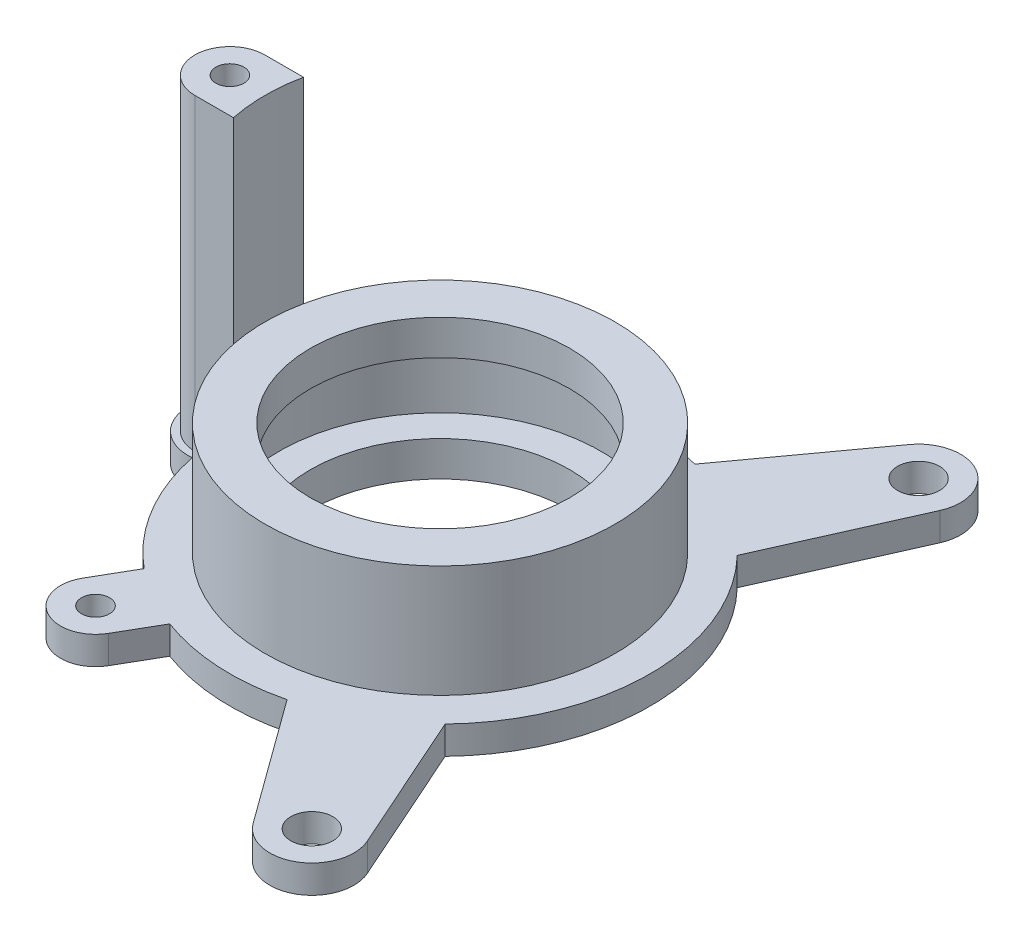
ISO-10303-21;
HEADER;
FILE_DESCRIPTION(('STEP AP214'),'2;1');
FILE_NAME('part.step','',(''),(''),'','','');
FILE_SCHEMA(('AUTOMOTIVE_DESIGN { 1 0 10303 214 1 1 1 1 }'));
ENDSEC;
DATA;
#1=APPLICATION_CONTEXT('core data for automotive mechanical design processes');
#2=APPLICATION_PROTOCOL_DEFINITION('international standard','automotive_design',2000,#1);
#3=PRODUCT_CONTEXT('',#1,'mechanical');
#4=PRODUCT('Part','Part','',(#3));
#5=PRODUCT_RELATED_PRODUCT_CATEGORY('part','',(#4));
#6=PRODUCT_DEFINITION_FORMATION('','',#4);
#7=PRODUCT_DEFINITION_CONTEXT('part definition',#1,'design');
#8=PRODUCT_DEFINITION('design','',#6,#7);
#9=PRODUCT_DEFINITION_SHAPE('','',#8);
#10=(LENGTH_UNIT() NAMED_UNIT(*) SI_UNIT(.MILLI.,.METRE.));
#11=(NAMED_UNIT(*) PLANE_ANGLE_UNIT() SI_UNIT($,.RADIAN.));
#12=(NAMED_UNIT(*) SI_UNIT($,.STERADIAN.) SOLID_ANGLE_UNIT());
#13=UNCERTAINTY_MEASURE_WITH_UNIT(LENGTH_MEASURE(1.E-05),#10,'distance_accuracy_value','');
#14=(GEOMETRIC_REPRESENTATION_CONTEXT(3) GLOBAL_UNCERTAINTY_ASSIGNED_CONTEXT((#13)) GLOBAL_UNIT_ASSIGNED_CONTEXT((#10,
#11,#12)) REPRESENTATION_CONTEXT('',''));
#15=CARTESIAN_POINT('',(0.,0.,0.));
#16=DIRECTION('',(0.,0.,1.));
#17=DIRECTION('',(1.,0.,0.));
#18=AXIS2_PLACEMENT_3D('',#15,#16,#17);
#19=CARTESIAN_POINT('',(0.,0.,0.));
#20=DIRECTION('',(0.,1.,0.));
#21=DIRECTION('',(0.,0.,1.));
#22=AXIS2_PLACEMENT_3D('',#19,#20,#21);
#23=PLANE('',#22);
#24=CARTESIAN_POINT('',(0.,0.,0.));
#25=DIRECTION('',(0.,1.,0.));
#26=DIRECTION('',(0.,0.,1.));
#27=AXIS2_PLACEMENT_3D('',#24,#25,#26);
#28=CIRCLE('',#27,9.25);
#29=CARTESIAN_POINT('',(0.,0.,9.25));
#30=VERTEX_POINT('',#29);
#31=EDGE_CURVE('E284',#30,#30,#28,.T.);
#32=ORIENTED_EDGE('',*,*,#31,.T.);
#33=EDGE_LOOP('',(#32));
#34=FACE_BOUND('',#33,.T.);
#35=CARTESIAN_POINT('',(-15.,0.,0.));
#36=DIRECTION('',(0.,1.,0.));
#37=DIRECTION('',(0.,0.,1.));
#38=AXIS2_PLACEMENT_3D('',#35,#36,#37);
#39=CIRCLE('',#38,1.);
#40=CARTESIAN_POINT('',(-15.,0.,1.));
#41=VERTEX_POINT('',#40);
#42=EDGE_CURVE('E220',#41,#41,#39,.T.);
#43=ORIENTED_EDGE('',*,*,#42,.T.);
#44=EDGE_LOOP('',(#43));
#45=FACE_BOUND('',#44,.T.);
#46=CARTESIAN_POINT('',(-9.00000000000008,0.,15.5884572681198));
#47=DIRECTION('',(0.,1.,0.));
#48=DIRECTION('',(0.,0.,1.));
#49=AXIS2_PLACEMENT_3D('',#46,#47,#48);
#50=CIRCLE('',#49,1.);
#51=CARTESIAN_POINT('',(-9.00000000000008,0.,16.5884572681198));
#52=VERTEX_POINT('',#51);
#53=EDGE_CURVE('E45',#52,#52,#50,.T.);
#54=ORIENTED_EDGE('',*,*,#53,.T.);
#55=EDGE_LOOP('',(#54));
#56=FACE_BOUND('',#55,.T.);
#57=CARTESIAN_POINT('',(12.4999999999999,0.,21.650635094611));
#58=DIRECTION('',(0.,1.,0.));
#59=DIRECTION('',(0.,0.,1.));
#60=AXIS2_PLACEMENT_3D('',#57,#58,#59);
#61=CIRCLE('',#60,1.5);
#62=CARTESIAN_POINT('',(12.4999999999999,0.,23.150635094611));
#63=VERTEX_POINT('',#62);
#64=EDGE_CURVE('E400',#63,#63,#61,.T.);
#65=ORIENTED_EDGE('',*,*,#64,.T.);
#66=EDGE_LOOP('',(#65));
#67=FACE_BOUND('',#66,.T.);
#68=CARTESIAN_POINT('',(12.4999999999999,0.,-21.650635094611));
#69=DIRECTION('',(0.,1.,0.));
#70=DIRECTION('',(0.,0.,1.));
#71=AXIS2_PLACEMENT_3D('',#68,#69,#70);
#72=CIRCLE('',#71,1.5);
#73=CARTESIAN_POINT('',(12.4999999999999,0.,-20.150635094611));
#74=VERTEX_POINT('',#73);
#75=EDGE_CURVE('E388',#74,#74,#72,.F.);
#76=ORIENTED_EDGE('',*,*,#75,.F.);
#77=EDGE_LOOP('',(#76));
#78=FACE_BOUND('',#77,.T.);
#79=CARTESIAN_POINT('',(-15.,0.,0.));
#80=DIRECTION('',(0.,1.,0.));
#81=DIRECTION('',(0.,0.,1.));
#82=AXIS2_PLACEMENT_3D('',#79,#80,#81);
#83=CIRCLE('',#82,3.);
#84=CARTESIAN_POINT('',(-14.7,0.,2.98496231131986));
#85=VERTEX_POINT('',#84);
#86=CARTESIAN_POINT('',(-14.7,0.,-2.98496231131986));
#87=VERTEX_POINT('',#86);
#88=EDGE_CURVE('E368',#85,#87,#83,.F.);
#89=ORIENTED_EDGE('',*,*,#88,.T.);
#90=CARTESIAN_POINT('',(0.,0.,0.));
#91=DIRECTION('',(0.,1.,0.));
#92=DIRECTION('',(0.,0.,1.));
#93=AXIS2_PLACEMENT_3D('',#90,#91,#92);
#94=CIRCLE('',#93,15.);
#95=CARTESIAN_POINT('',(-9.56016323833567,0.,-11.5586884574495));
#96=VERTEX_POINT('',#95);
#97=EDGE_CURVE('E404',#87,#96,#94,.F.);
#98=ORIENTED_EDGE('',*,*,#97,.T.);
#99=DIRECTION('',(-0.500000000000004,0.,-0.866025403784436));
#100=VECTOR('',#99,1.);
#101=CARTESIAN_POINT('',(-2.16506350946109,0.,1.25000000000001));
#102=LINE('',#101,#100);
#103=CARTESIAN_POINT('',(-11.1650635094612,0.,-14.3384572681198));
#104=VERTEX_POINT('',#103);
#105=EDGE_CURVE('E391',#96,#104,#102,.T.);
#106=ORIENTED_EDGE('',*,*,#105,.T.);
#107=CARTESIAN_POINT('',(-9.00000000000008,0.,-15.5884572681198));
#108=DIRECTION('',(0.,1.,0.));
#109=DIRECTION('',(0.,0.,1.));
#110=AXIS2_PLACEMENT_3D('',#107,#108,#109);
#111=CIRCLE('',#110,2.5);
#112=CARTESIAN_POINT('',(-6.83493649053898,0.,-16.8384572681199));
#113=VERTEX_POINT('',#112);
#114=EDGE_CURVE('E380',#104,#113,#111,.F.);
#115=ORIENTED_EDGE('',*,*,#114,.T.);
#116=DIRECTION('',(-0.500000000000004,0.,-0.866025403784436));
#117=VECTOR('',#116,1.);
#118=CARTESIAN_POINT('',(2.16506350946109,0.,-1.25000000000001));
#119=LINE('',#118,#117);
#120=CARTESIAN_POINT('',(-5.23003621941349,0.,-14.0586884574495));
#121=VERTEX_POINT('',#120);
#122=EDGE_CURVE('E374',#121,#113,#119,.T.);
#123=ORIENTED_EDGE('',*,*,#122,.F.);
#124=CARTESIAN_POINT('',(3.63498864822928,0.,-14.5528985953742));
#125=VERTEX_POINT('',#124);
#126=EDGE_CURVE('E595',#121,#125,#94,.F.);
#127=ORIENTED_EDGE('',*,*,#126,.T.);
#128=DIRECTION('',(0.587785252292465,0.,-0.809016994374953));
#129=VECTOR('',#128,1.);
#130=CARTESIAN_POINT('',(-4.54118356261046,0.,-3.29936298571533));
#131=LINE('',#130,#129);
#132=CARTESIAN_POINT('',(10.0729490168751,0.,-23.4139908514884));
#133=VERTEX_POINT('',#132);
#134=EDGE_CURVE('E379',#125,#133,#131,.T.);
#135=ORIENTED_EDGE('',*,*,#134,.T.);
#136=CARTESIAN_POINT('',(12.4999999999999,0.,-21.650635094611));
#137=DIRECTION('',(0.,1.,0.));
#138=DIRECTION('',(0.,0.,1.));
#139=AXIS2_PLACEMENT_3D('',#136,#137,#138);
#140=CIRCLE('',#139,3.);
#141=CARTESIAN_POINT('',(15.2406363729277,0.,-20.4304251653836));
#142=VERTEX_POINT('',#141);
#143=EDGE_CURVE('E376',#133,#142,#140,.F.);
#144=ORIENTED_EDGE('',*,*,#143,.T.);
#145=DIRECTION('',(0.406736643075804,0.,-0.913545457642599));
#146=VECTOR('',#145,1.);
#147=CARTESIAN_POINT('',(5.12792394324079,0.,2.28309883561129));
#148=LINE('',#147,#146);
#149=CARTESIAN_POINT('',(10.7856855581782,0.,-10.4244418095218));
#150=VERTEX_POINT('',#149);
#151=EDGE_CURVE('E372',#150,#142,#148,.T.);
#152=ORIENTED_EDGE('',*,*,#151,.F.);
#153=CARTESIAN_POINT('',(10.7856855581782,0.,10.4244418095218));
#154=VERTEX_POINT('',#153);
#155=EDGE_CURVE('E369',#150,#154,#94,.F.);
#156=ORIENTED_EDGE('',*,*,#155,.T.);
#157=DIRECTION('',(0.406736643075804,0.,0.913545457642599));
#158=VECTOR('',#157,1.);
#159=CARTESIAN_POINT('',(5.12792394324079,0.,-2.28309883561129));
#160=LINE('',#159,#158);
#161=CARTESIAN_POINT('',(15.2406363729277,0.,20.4304251653836));
#162=VERTEX_POINT('',#161);
#163=EDGE_CURVE('E11',#154,#162,#160,.T.);
#164=ORIENTED_EDGE('',*,*,#163,.T.);
#165=CARTESIAN_POINT('',(12.4999999999999,0.,21.650635094611));
#166=DIRECTION('',(0.,1.,0.));
#167=DIRECTION('',(0.,0.,1.));
#168=AXIS2_PLACEMENT_3D('',#165,#166,#167);
#169=CIRCLE('',#168,3.);
#170=CARTESIAN_POINT('',(10.0729490168751,0.,23.4139908514884));
#171=VERTEX_POINT('',#170);
#172=EDGE_CURVE('E64',#171,#162,#169,.T.);
#173=ORIENTED_EDGE('',*,*,#172,.F.);
#174=DIRECTION('',(0.587785252292465,0.,0.809016994374953));
#175=VECTOR('',#174,1.);
#176=CARTESIAN_POINT('',(-4.54118356261046,0.,3.29936298571533));
#177=LINE('',#176,#175);
#178=CARTESIAN_POINT('',(3.63498864822928,0.,14.5528985953742));
#179=VERTEX_POINT('',#178);
#180=EDGE_CURVE('E361',#179,#171,#177,.T.);
#181=ORIENTED_EDGE('',*,*,#180,.F.);
#182=CARTESIAN_POINT('',(-5.23003621941349,0.,14.0586884574495));
#183=VERTEX_POINT('',#182);
#184=EDGE_CURVE('E365',#179,#183,#94,.F.);
#185=ORIENTED_EDGE('',*,*,#184,.T.);
#186=DIRECTION('',(-0.500000000000004,0.,0.866025403784436));
#187=VECTOR('',#186,1.);
#188=CARTESIAN_POINT('',(2.16506350946109,0.,1.25000000000001));
#189=LINE('',#188,#187);
#190=CARTESIAN_POINT('',(-6.83493649053898,0.,16.8384572681199));
#191=VERTEX_POINT('',#190);
#192=EDGE_CURVE('E50',#183,#191,#189,.T.);
#193=ORIENTED_EDGE('',*,*,#192,.T.);
#194=CARTESIAN_POINT('',(-9.00000000000008,0.,15.5884572681198));
#195=DIRECTION('',(0.,1.,0.));
#196=DIRECTION('',(0.,0.,1.));
#197=AXIS2_PLACEMENT_3D('',#194,#195,#196);
#198=CIRCLE('',#197,2.5);
#199=CARTESIAN_POINT('',(-11.1650635094612,0.,14.3384572681198));
#200=VERTEX_POINT('',#199);
#201=EDGE_CURVE('E364',#200,#191,#198,.T.);
#202=ORIENTED_EDGE('',*,*,#201,.F.);
#203=DIRECTION('',(-0.500000000000004,0.,0.866025403784436));
#204=VECTOR('',#203,1.);
#205=CARTESIAN_POINT('',(-2.16506350946109,0.,-1.25000000000001));
#206=LINE('',#205,#204);
#207=CARTESIAN_POINT('',(-9.56016323833567,0.,11.5586884574495));
#208=VERTEX_POINT('',#207);
#209=EDGE_CURVE('E375',#208,#200,#206,.T.);
#210=ORIENTED_EDGE('',*,*,#209,.F.);
#211=EDGE_CURVE('E370',#208,#85,#94,.F.);
#212=ORIENTED_EDGE('',*,*,#211,.T.);
#213=EDGE_LOOP('',(#89,#98,#106,#115,#123,#127,#135,#144,#152,#156,#164,#173,#181,#185,#193,
#202,#210,#212));
#214=FACE_BOUND('',#213,.T.);
#215=CARTESIAN_POINT('',(-9.00000000000008,0.,-15.5884572681198));
#216=DIRECTION('',(0.,1.,0.));
#217=DIRECTION('',(0.,0.,1.));
#218=AXIS2_PLACEMENT_3D('',#215,#216,#217);
#219=CIRCLE('',#218,1.);
#220=CARTESIAN_POINT('',(-9.00000000000008,0.,-14.5884572681198));
#221=VERTEX_POINT('',#220);
#222=EDGE_CURVE('E398',#221,#221,#219,.F.);
#223=ORIENTED_EDGE('',*,*,#222,.F.);
#224=EDGE_LOOP('',(#223));
#225=FACE_BOUND('',#224,.T.);
#226=ADVANCED_FACE('F41',(#34,#45,#56,#67,#78,#214,#225),#23,.F.);
#227=CARTESIAN_POINT('',(0.,10.,0.));
#228=DIRECTION('',(0.,-1.,0.));
#229=DIRECTION('',(0.,0.,-1.));
#230=AXIS2_PLACEMENT_3D('',#227,#228,#229);
#231=CYLINDRICAL_SURFACE('',#230,9.25);
#232=CARTESIAN_POINT('',(0.,7.5,0.));
#233=DIRECTION('',(0.,1.,0.));
#234=DIRECTION('',(0.,0.,1.));
#235=AXIS2_PLACEMENT_3D('',#232,#233,#234);
#236=CIRCLE('',#235,9.25);
#237=CARTESIAN_POINT('',(0.,7.5,9.25));
#238=VERTEX_POINT('',#237);
#239=EDGE_CURVE('E331',#238,#238,#236,.T.);
#240=ORIENTED_EDGE('',*,*,#239,.F.);
#241=EDGE_LOOP('',(#240));
#242=FACE_BOUND('',#241,.T.);
#243=CARTESIAN_POINT('',(0.,10.,0.));
#244=DIRECTION('',(0.,1.,0.));
#245=DIRECTION('',(0.,0.,1.));
#246=AXIS2_PLACEMENT_3D('',#243,#244,#245);
#247=CIRCLE('',#246,9.25);
#248=CARTESIAN_POINT('',(0.,10.,9.25));
#249=VERTEX_POINT('',#248);
#250=EDGE_CURVE('E349',#249,#249,#247,.T.);
#251=ORIENTED_EDGE('',*,*,#250,.T.);
#252=EDGE_LOOP('',(#251));
#253=FACE_BOUND('',#252,.T.);
#254=ADVANCED_FACE('F442',(#242,#253),#231,.F.);
#255=CARTESIAN_POINT('',(0.,10.,0.));
#256=DIRECTION('',(0.,1.,0.));
#257=DIRECTION('',(0.,0.,1.));
#258=AXIS2_PLACEMENT_3D('',#255,#256,#257);
#259=PLANE('',#258);
#260=CARTESIAN_POINT('',(0.,10.,0.));
#261=DIRECTION('',(0.,1.,0.));
#262=DIRECTION('',(0.,0.,1.));
#263=AXIS2_PLACEMENT_3D('',#260,#261,#262);
#264=CIRCLE('',#263,12.5);
#265=CARTESIAN_POINT('',(-12.2474487139159,10.,-2.5));
#266=VERTEX_POINT('',#265);
#267=CARTESIAN_POINT('',(-12.2474487139159,10.,2.5));
#268=VERTEX_POINT('',#267);
#269=EDGE_CURVE('E346',#266,#268,#264,.T.);
#270=ORIENTED_EDGE('',*,*,#269,.T.);
#271=EDGE_CURVE('E343',#268,#266,#264,.T.);
#272=ORIENTED_EDGE('',*,*,#271,.T.);
#273=EDGE_LOOP('',(#270,#272));
#274=FACE_BOUND('',#273,.T.);
#275=ORIENTED_EDGE('',*,*,#250,.F.);
#276=EDGE_LOOP('',(#275));
#277=FACE_BOUND('',#276,.T.);
#278=ADVANCED_FACE('F452',(#274,#277),#259,.T.);
#279=CARTESIAN_POINT('',(0.,24.,-2.5));
#280=DIRECTION('',(0.,0.,-1.));
#281=DIRECTION('',(-1.,0.,0.));
#282=AXIS2_PLACEMENT_3D('',#279,#280,#281);
#283=PLANE('',#282);
#284=DIRECTION('',(1.,0.,0.));
#285=VECTOR('',#284,1.);
#286=CARTESIAN_POINT('',(0.,2.,-2.5));
#287=LINE('',#286,#285);
#288=CARTESIAN_POINT('',(-15.,2.,-2.5));
#289=VERTEX_POINT('',#288);
#290=CARTESIAN_POINT('',(-12.2474487139159,2.,-2.5));
#291=VERTEX_POINT('',#290);
#292=EDGE_CURVE('E289',#289,#291,#287,.T.);
#293=ORIENTED_EDGE('',*,*,#292,.F.);
#294=DIRECTION('',(0.,-1.,0.));
#295=VECTOR('',#294,1.);
#296=CARTESIAN_POINT('',(-15.,24.,-2.5));
#297=LINE('',#296,#295);
#298=CARTESIAN_POINT('',(-15.,24.,-2.5));
#299=VERTEX_POINT('',#298);
#300=EDGE_CURVE('E299',#299,#289,#297,.T.);
#301=ORIENTED_EDGE('',*,*,#300,.F.);
#302=DIRECTION('',(1.,0.,0.));
#303=VECTOR('',#302,1.);
#304=CARTESIAN_POINT('',(0.,24.,-2.5));
#305=LINE('',#304,#303);
#306=CARTESIAN_POINT('',(-12.2474487139159,24.,-2.5));
#307=VERTEX_POINT('',#306);
#308=EDGE_CURVE('E296',#299,#307,#305,.T.);
#309=ORIENTED_EDGE('',*,*,#308,.T.);
#310=DIRECTION('',(0.,-1.,0.));
#311=VECTOR('',#310,1.);
#312=CARTESIAN_POINT('',(-12.2474487139159,24.,-2.5));
#313=LINE('',#312,#311);
#314=EDGE_CURVE('E309',#307,#266,#313,.T.);
#315=ORIENTED_EDGE('',*,*,#314,.T.);
#316=EDGE_CURVE('E308',#266,#291,#313,.T.);
#317=ORIENTED_EDGE('',*,*,#316,.T.);
#318=EDGE_LOOP('',(#293,#301,#309,#315,#317));
#319=FACE_BOUND('',#318,.T.);
#320=ADVANCED_FACE('F460',(#319),#283,.T.);
#321=CARTESIAN_POINT('',(0.,24.,0.));
#322=DIRECTION('',(0.,-1.,0.));
#323=DIRECTION('',(0.,0.,-1.));
#324=AXIS2_PLACEMENT_3D('',#321,#322,#323);
#325=CYLINDRICAL_SURFACE('',#324,12.5);
#326=ORIENTED_EDGE('',*,*,#269,.F.);
#327=ORIENTED_EDGE('',*,*,#314,.F.);
#328=CARTESIAN_POINT('',(0.,24.,0.));
#329=DIRECTION('',(0.,1.,0.));
#330=DIRECTION('',(0.,0.,1.));
#331=AXIS2_PLACEMENT_3D('',#328,#329,#330);
#332=CIRCLE('',#331,12.5);
#333=CARTESIAN_POINT('',(-12.2474487139159,24.,2.5));
#334=VERTEX_POINT('',#333);
#335=EDGE_CURVE('E294',#334,#307,#332,.F.);
#336=ORIENTED_EDGE('',*,*,#335,.F.);
#337=DIRECTION('',(0.,-1.,0.));
#338=VECTOR('',#337,1.);
#339=CARTESIAN_POINT('',(-12.2474487139159,24.,2.5));
#340=LINE('',#339,#338);
#341=EDGE_CURVE('E313',#334,#268,#340,.T.);
#342=ORIENTED_EDGE('',*,*,#341,.T.);
#343=EDGE_LOOP('',(#326,#327,#336,#342));
#344=FACE_BOUND('',#343,.T.);
#345=ADVANCED_FACE('F506',(#344),#325,.F.);
#346=CARTESIAN_POINT('',(0.,24.,2.5));
#347=DIRECTION('',(0.,0.,-1.));
#348=DIRECTION('',(-1.,0.,0.));
#349=AXIS2_PLACEMENT_3D('',#346,#347,#348);
#350=PLANE('',#349);
#351=DIRECTION('',(1.,0.,0.));
#352=VECTOR('',#351,1.);
#353=CARTESIAN_POINT('',(0.,2.,2.5));
#354=LINE('',#353,#352);
#355=CARTESIAN_POINT('',(-15.,2.,2.5));
#356=VERTEX_POINT('',#355);
#357=CARTESIAN_POINT('',(-12.2474487139159,2.,2.5));
#358=VERTEX_POINT('',#357);
#359=EDGE_CURVE('E302',#356,#358,#354,.T.);
#360=ORIENTED_EDGE('',*,*,#359,.T.);
#361=EDGE_CURVE('E312',#268,#358,#340,.T.);
#362=ORIENTED_EDGE('',*,*,#361,.F.);
#363=ORIENTED_EDGE('',*,*,#341,.F.);
#364=DIRECTION('',(1.,0.,0.));
#365=VECTOR('',#364,1.);
#366=CARTESIAN_POINT('',(0.,24.,2.5));
#367=LINE('',#366,#365);
#368=CARTESIAN_POINT('',(-15.,24.,2.5));
#369=VERTEX_POINT('',#368);
#370=EDGE_CURVE('E292',#369,#334,#367,.T.);
#371=ORIENTED_EDGE('',*,*,#370,.F.);
#372=DIRECTION('',(0.,-1.,0.));
#373=VECTOR('',#372,1.);
#374=CARTESIAN_POINT('',(-15.,24.,2.5));
#375=LINE('',#374,#373);
#376=EDGE_CURVE('E316',#369,#356,#375,.T.);
#377=ORIENTED_EDGE('',*,*,#376,.T.);
#378=EDGE_LOOP('',(#360,#362,#363,#371,#377));
#379=FACE_BOUND('',#378,.T.);
#380=ADVANCED_FACE('F502',(#379),#350,.F.);
#381=CARTESIAN_POINT('',(-15.,24.,0.));
#382=DIRECTION('',(0.,-1.,0.));
#383=DIRECTION('',(0.,0.,-1.));
#384=AXIS2_PLACEMENT_3D('',#381,#382,#383);
#385=CYLINDRICAL_SURFACE('',#384,2.5);
#386=CARTESIAN_POINT('',(-15.,2.,0.));
#387=DIRECTION('',(0.,1.,0.));
#388=DIRECTION('',(0.,0.,1.));
#389=AXIS2_PLACEMENT_3D('',#386,#387,#388);
#390=CIRCLE('',#389,2.5);
#391=EDGE_CURVE('E280',#289,#356,#390,.T.);
#392=ORIENTED_EDGE('',*,*,#391,.T.);
#393=ORIENTED_EDGE('',*,*,#376,.F.);
#394=CARTESIAN_POINT('',(-15.,24.,0.));
#395=DIRECTION('',(0.,1.,0.));
#396=DIRECTION('',(0.,0.,1.));
#397=AXIS2_PLACEMENT_3D('',#394,#395,#396);
#398=CIRCLE('',#397,2.5);
#399=EDGE_CURVE('E288',#299,#369,#398,.T.);
#400=ORIENTED_EDGE('',*,*,#399,.F.);
#401=ORIENTED_EDGE('',*,*,#300,.T.);
#402=EDGE_LOOP('',(#392,#393,#400,#401));
#403=FACE_BOUND('',#402,.T.);
#404=ADVANCED_FACE('F499',(#403),#385,.T.);
#405=CARTESIAN_POINT('',(0.,24.,0.));
#406=DIRECTION('',(0.,1.,0.));
#407=DIRECTION('',(0.,0.,1.));
#408=AXIS2_PLACEMENT_3D('',#405,#406,#407);
#409=PLANE('',#408);
#410=CARTESIAN_POINT('',(-15.,24.,0.));
#411=DIRECTION('',(0.,1.,0.));
#412=DIRECTION('',(0.,0.,1.));
#413=AXIS2_PLACEMENT_3D('',#410,#411,#412);
#414=CIRCLE('',#413,1.);
#415=CARTESIAN_POINT('',(-15.,24.,1.));
#416=VERTEX_POINT('',#415);
#417=EDGE_CURVE('E285',#416,#416,#414,.T.);
#418=ORIENTED_EDGE('',*,*,#417,.F.);
#419=EDGE_LOOP('',(#418));
#420=FACE_BOUND('',#419,.T.);
#421=ORIENTED_EDGE('',*,*,#399,.T.);
#422=ORIENTED_EDGE('',*,*,#370,.T.);
#423=ORIENTED_EDGE('',*,*,#335,.T.);
#424=ORIENTED_EDGE('',*,*,#308,.F.);
#425=EDGE_LOOP('',(#421,#422,#423,#424));
#426=FACE_BOUND('',#425,.T.);
#427=ADVANCED_FACE('F497',(#420,#426),#409,.T.);
#428=CARTESIAN_POINT('',(-15.,24.,0.));
#429=DIRECTION('',(0.,-1.,0.));
#430=DIRECTION('',(0.,0.,-1.));
#431=AXIS2_PLACEMENT_3D('',#428,#429,#430);
#432=CYLINDRICAL_SURFACE('',#431,1.);
#433=ORIENTED_EDGE('',*,*,#417,.T.);
#434=EDGE_LOOP('',(#433));
#435=FACE_BOUND('',#434,.T.);
#436=ORIENTED_EDGE('',*,*,#42,.F.);
#437=EDGE_LOOP('',(#436));
#438=FACE_BOUND('',#437,.T.);
#439=ADVANCED_FACE('F494',(#435,#438),#432,.F.);
#440=CARTESIAN_POINT('',(0.,10.,0.));
#441=DIRECTION('',(0.,-1.,0.));
#442=DIRECTION('',(0.,0.,-1.));
#443=AXIS2_PLACEMENT_3D('',#440,#441,#442);
#444=CYLINDRICAL_SURFACE('',#443,12.5);
#445=ORIENTED_EDGE('',*,*,#361,.T.);
#446=CARTESIAN_POINT('',(0.,2.,0.));
#447=DIRECTION('',(0.,-1.,0.));
#448=DIRECTION('',(0.,0.,-1.));
#449=AXIS2_PLACEMENT_3D('',#446,#447,#448);
#450=CIRCLE('',#449,12.5);
#451=EDGE_CURVE('E352',#291,#358,#450,.T.);
#452=ORIENTED_EDGE('',*,*,#451,.F.);
#453=ORIENTED_EDGE('',*,*,#316,.F.);
#454=ORIENTED_EDGE('',*,*,#271,.F.);
#455=EDGE_LOOP('',(#445,#452,#453,#454));
#456=FACE_BOUND('',#455,.T.);
#457=ADVANCED_FACE('F43',(#456),#444,.T.);
#458=CARTESIAN_POINT('',(0.,2.,0.));
#459=DIRECTION('',(0.,-1.,0.));
#460=DIRECTION('',(0.,0.,-1.));
#461=AXIS2_PLACEMENT_3D('',#458,#459,#460);
#462=CYLINDRICAL_SURFACE('',#461,15.);
#463=ORIENTED_EDGE('',*,*,#97,.F.);
#464=DIRECTION('',(0.,-1.,0.));
#465=VECTOR('',#464,1.);
#466=CARTESIAN_POINT('',(-14.7,2.,-2.98496231131986));
#467=LINE('',#466,#465);
#468=CARTESIAN_POINT('',(-14.7,2.,-2.98496231131986));
#469=VERTEX_POINT('',#468);
#470=EDGE_CURVE('E325',#469,#87,#467,.T.);
#471=ORIENTED_EDGE('',*,*,#470,.F.);
#472=CARTESIAN_POINT('',(0.,2.,0.));
#473=DIRECTION('',(0.,-1.,0.));
#474=DIRECTION('',(0.,0.,-1.));
#475=AXIS2_PLACEMENT_3D('',#472,#473,#474);
#476=CIRCLE('',#475,15.);
#477=CARTESIAN_POINT('',(-9.56016323833567,2.,-11.5586884574495));
#478=VERTEX_POINT('',#477);
#479=EDGE_CURVE('E322',#469,#478,#476,.T.);
#480=ORIENTED_EDGE('',*,*,#479,.T.);
#481=DIRECTION('',(0.,-1.,0.));
#482=VECTOR('',#481,1.);
#483=CARTESIAN_POINT('',(-9.56016323833567,2.,-11.5586884574495));
#484=LINE('',#483,#482);
#485=EDGE_CURVE('E356',#96,#478,#484,.F.);
#486=ORIENTED_EDGE('',*,*,#485,.F.);
#487=EDGE_LOOP('',(#463,#471,#480,#486));
#488=FACE_BOUND('',#487,.T.);
#489=ADVANCED_FACE('F521',(#488),#462,.T.);
#490=CARTESIAN_POINT('',(-2.16506350946109,-3.,1.25000000000001));
#491=DIRECTION('',(-0.866025403784436,0.,0.500000000000004));
#492=DIRECTION('',(0.500000000000004,0.,0.866025403784436));
#493=AXIS2_PLACEMENT_3D('',#490,#491,#492);
#494=PLANE('',#493);
#495=ORIENTED_EDGE('',*,*,#105,.F.);
#496=ORIENTED_EDGE('',*,*,#485,.T.);
#497=DIRECTION('',(0.500000000000004,0.,0.866025403784436));
#498=VECTOR('',#497,1.);
#499=CARTESIAN_POINT('',(-2.16506350946109,2.,1.25000000000001));
#500=LINE('',#499,#498);
#501=CARTESIAN_POINT('',(-11.1650635094612,2.,-14.3384572681198));
#502=VERTEX_POINT('',#501);
#503=EDGE_CURVE('E264',#502,#478,#500,.T.);
#504=ORIENTED_EDGE('',*,*,#503,.F.);
#505=DIRECTION('',(0.,1.,0.));
#506=VECTOR('',#505,1.);
#507=CARTESIAN_POINT('',(-11.1650635094612,-3.,-14.3384572681198));
#508=LINE('',#507,#506);
#509=EDGE_CURVE('E278',#104,#502,#508,.T.);
#510=ORIENTED_EDGE('',*,*,#509,.F.);
#511=EDGE_LOOP('',(#495,#496,#504,#510));
#512=FACE_BOUND('',#511,.T.);
#513=ADVANCED_FACE('F517',(#512),#494,.T.);
#514=CARTESIAN_POINT('',(-9.00000000000008,-3.,-15.5884572681198));
#515=DIRECTION('',(0.,1.,0.));
#516=DIRECTION('',(0.,0.,1.));
#517=AXIS2_PLACEMENT_3D('',#514,#515,#516);
#518=CYLINDRICAL_SURFACE('',#517,2.5);
#519=ORIENTED_EDGE('',*,*,#114,.F.);
#520=ORIENTED_EDGE('',*,*,#509,.T.);
#521=CARTESIAN_POINT('',(-9.00000000000008,2.,-15.5884572681198));
#522=DIRECTION('',(0.,1.,0.));
#523=DIRECTION('',(0.,0.,1.));
#524=AXIS2_PLACEMENT_3D('',#521,#522,#523);
#525=CIRCLE('',#524,2.5);
#526=CARTESIAN_POINT('',(-6.83493649053898,2.,-16.8384572681199));
#527=VERTEX_POINT('',#526);
#528=EDGE_CURVE('E271',#527,#502,#525,.T.);
#529=ORIENTED_EDGE('',*,*,#528,.F.);
#530=DIRECTION('',(0.,1.,0.));
#531=VECTOR('',#530,1.);
#532=CARTESIAN_POINT('',(-6.83493649053898,-3.,-16.8384572681199));
#533=LINE('',#532,#531);
#534=EDGE_CURVE('E277',#113,#527,#533,.T.);
#535=ORIENTED_EDGE('',*,*,#534,.F.);
#536=EDGE_LOOP('',(#519,#520,#529,#535));
#537=FACE_BOUND('',#536,.T.);
#538=ADVANCED_FACE('F520',(#537),#518,.T.);
#539=CARTESIAN_POINT('',(12.4999999999999,-3.,-21.650635094611));
#540=DIRECTION('',(0.,1.,0.));
#541=DIRECTION('',(0.,0.,1.));
#542=AXIS2_PLACEMENT_3D('',#539,#540,#541);
#543=CYLINDRICAL_SURFACE('',#542,3.);
#544=ORIENTED_EDGE('',*,*,#143,.F.);
#545=DIRECTION('',(0.,1.,0.));
#546=VECTOR('',#545,1.);
#547=CARTESIAN_POINT('',(10.0729490168751,-3.,-23.4139908514884));
#548=LINE('',#547,#546);
#549=CARTESIAN_POINT('',(10.0729490168751,2.,-23.4139908514884));
#550=VERTEX_POINT('',#549);
#551=EDGE_CURVE('E261',#133,#550,#548,.T.);
#552=ORIENTED_EDGE('',*,*,#551,.T.);
#553=CARTESIAN_POINT('',(12.4999999999999,2.,-21.650635094611));
#554=DIRECTION('',(0.,1.,0.));
#555=DIRECTION('',(0.,0.,1.));
#556=AXIS2_PLACEMENT_3D('',#553,#554,#555);
#557=CIRCLE('',#556,3.);
#558=CARTESIAN_POINT('',(15.2406363729277,2.,-20.4304251653836));
#559=VERTEX_POINT('',#558);
#560=EDGE_CURVE('E252',#559,#550,#557,.T.);
#561=ORIENTED_EDGE('',*,*,#560,.F.);
#562=DIRECTION('',(0.,1.,0.));
#563=VECTOR('',#562,1.);
#564=CARTESIAN_POINT('',(15.2406363729277,-3.,-20.4304251653836));
#565=LINE('',#564,#563);
#566=EDGE_CURVE('E262',#142,#559,#565,.T.);
#567=ORIENTED_EDGE('',*,*,#566,.F.);
#568=EDGE_LOOP('',(#544,#552,#561,#567));
#569=FACE_BOUND('',#568,.T.);
#570=ADVANCED_FACE('F528',(#569),#543,.T.);
#571=ORIENTED_EDGE('',*,*,#211,.F.);
#572=DIRECTION('',(0.,-1.,0.));
#573=VECTOR('',#572,1.);
#574=CARTESIAN_POINT('',(-9.56016323833567,2.,11.5586884574495));
#575=LINE('',#574,#573);
#576=CARTESIAN_POINT('',(-9.56016323833567,2.,11.5586884574494));
#577=VERTEX_POINT('',#576);
#578=EDGE_CURVE('E247',#208,#577,#575,.F.);
#579=ORIENTED_EDGE('',*,*,#578,.T.);
#580=CARTESIAN_POINT('',(-14.7,2.,2.98496231131986));
#581=VERTEX_POINT('',#580);
#582=EDGE_CURVE('E321',#577,#581,#476,.T.);
#583=ORIENTED_EDGE('',*,*,#582,.T.);
#584=DIRECTION('',(0.,-1.,0.));
#585=VECTOR('',#584,1.);
#586=CARTESIAN_POINT('',(-14.7,2.,2.98496231131986));
#587=LINE('',#586,#585);
#588=EDGE_CURVE('E328',#581,#85,#587,.T.);
#589=ORIENTED_EDGE('',*,*,#588,.T.);
#590=EDGE_LOOP('',(#571,#579,#583,#589));
#591=FACE_BOUND('',#590,.T.);
#592=ADVANCED_FACE('F492',(#591),#462,.T.);
#593=CARTESIAN_POINT('',(12.4999999999999,-3.,21.650635094611));
#594=DIRECTION('',(0.,1.,0.));
#595=DIRECTION('',(0.,0.,1.));
#596=AXIS2_PLACEMENT_3D('',#593,#594,#595);
#597=CYLINDRICAL_SURFACE('',#596,3.);
#598=DIRECTION('',(0.,1.,0.));
#599=VECTOR('',#598,1.);
#600=CARTESIAN_POINT('',(10.0729490168751,-3.,23.4139908514884));
#601=LINE('',#600,#599);
#602=CARTESIAN_POINT('',(10.0729490168751,2.,23.4139908514884));
#603=VERTEX_POINT('',#602);
#604=EDGE_CURVE('E201',#171,#603,#601,.T.);
#605=ORIENTED_EDGE('',*,*,#604,.F.);
#606=ORIENTED_EDGE('',*,*,#172,.T.);
#607=DIRECTION('',(0.,1.,0.));
#608=VECTOR('',#607,1.);
#609=CARTESIAN_POINT('',(15.2406363729277,-3.,20.4304251653836));
#610=LINE('',#609,#608);
#611=CARTESIAN_POINT('',(15.2406363729277,2.,20.4304251653836));
#612=VERTEX_POINT('',#611);
#613=EDGE_CURVE('E195',#162,#612,#610,.T.);
#614=ORIENTED_EDGE('',*,*,#613,.T.);
#615=CARTESIAN_POINT('',(12.4999999999999,2.,21.650635094611));
#616=DIRECTION('',(0.,-1.,0.));
#617=DIRECTION('',(0.,0.,-1.));
#618=AXIS2_PLACEMENT_3D('',#615,#616,#617);
#619=CIRCLE('',#618,3.);
#620=EDGE_CURVE('E199',#612,#603,#619,.T.);
#621=ORIENTED_EDGE('',*,*,#620,.T.);
#622=EDGE_LOOP('',(#605,#606,#614,#621));
#623=FACE_BOUND('',#622,.T.);
#624=ADVANCED_FACE('F197',(#623),#597,.T.);
#625=CARTESIAN_POINT('',(0.,2.,0.));
#626=DIRECTION('',(0.,-1.,0.));
#627=DIRECTION('',(0.,0.,-1.));
#628=AXIS2_PLACEMENT_3D('',#625,#626,#627);
#629=PLANE('',#628);
#630=CARTESIAN_POINT('',(3.63498864822928,2.,14.5528985953742));
#631=VERTEX_POINT('',#630);
#632=CARTESIAN_POINT('',(-5.23003621941349,2.,14.0586884574495));
#633=VERTEX_POINT('',#632);
#634=EDGE_CURVE('E327',#631,#633,#476,.T.);
#635=ORIENTED_EDGE('',*,*,#634,.F.);
#636=DIRECTION('',(-0.587785252292465,0.,-0.809016994374953));
#637=VECTOR('',#636,1.);
#638=CARTESIAN_POINT('',(-4.54118356261046,2.,3.29936298571533));
#639=LINE('',#638,#637);
#640=EDGE_CURVE('E202',#603,#631,#639,.T.);
#641=ORIENTED_EDGE('',*,*,#640,.F.);
#642=ORIENTED_EDGE('',*,*,#620,.F.);
#643=DIRECTION('',(-0.406736643075804,0.,-0.913545457642599));
#644=VECTOR('',#643,1.);
#645=CARTESIAN_POINT('',(5.12792394324079,2.,-2.28309883561129));
#646=LINE('',#645,#644);
#647=CARTESIAN_POINT('',(10.7856855581782,2.,10.4244418095218));
#648=VERTEX_POINT('',#647);
#649=EDGE_CURVE('E205',#612,#648,#646,.T.);
#650=ORIENTED_EDGE('',*,*,#649,.T.);
#651=CARTESIAN_POINT('',(10.7856855581782,2.,-10.4244418095218));
#652=VERTEX_POINT('',#651);
#653=EDGE_CURVE('E570',#652,#648,#476,.T.);
#654=ORIENTED_EDGE('',*,*,#653,.F.);
#655=DIRECTION('',(-0.406736643075804,0.,0.913545457642599));
#656=VECTOR('',#655,1.);
#657=CARTESIAN_POINT('',(5.12792394324079,2.,2.28309883561129));
#658=LINE('',#657,#656);
#659=EDGE_CURVE('E258',#559,#652,#658,.T.);
#660=ORIENTED_EDGE('',*,*,#659,.F.);
#661=ORIENTED_EDGE('',*,*,#560,.T.);
#662=DIRECTION('',(-0.587785252292465,0.,0.809016994374953));
#663=VECTOR('',#662,1.);
#664=CARTESIAN_POINT('',(-4.54118356261046,2.,-3.29936298571533));
#665=LINE('',#664,#663);
#666=CARTESIAN_POINT('',(3.63498864822928,2.,-14.5528985953742));
#667=VERTEX_POINT('',#666);
#668=EDGE_CURVE('E255',#550,#667,#665,.T.);
#669=ORIENTED_EDGE('',*,*,#668,.T.);
#670=CARTESIAN_POINT('',(-5.23003621941349,2.,-14.0586884574495));
#671=VERTEX_POINT('',#670);
#672=EDGE_CURVE('E326',#671,#667,#476,.T.);
#673=ORIENTED_EDGE('',*,*,#672,.F.);
#674=DIRECTION('',(0.500000000000004,0.,0.866025403784436));
#675=VECTOR('',#674,1.);
#676=CARTESIAN_POINT('',(2.16506350946109,2.,-1.25000000000001));
#677=LINE('',#676,#675);
#678=EDGE_CURVE('E268',#527,#671,#677,.T.);
#679=ORIENTED_EDGE('',*,*,#678,.F.);
#680=ORIENTED_EDGE('',*,*,#528,.T.);
#681=ORIENTED_EDGE('',*,*,#503,.T.);
#682=ORIENTED_EDGE('',*,*,#479,.F.);
#683=CARTESIAN_POINT('',(-15.,2.,0.));
#684=DIRECTION('',(0.,-1.,0.));
#685=DIRECTION('',(0.,0.,-1.));
#686=AXIS2_PLACEMENT_3D('',#683,#684,#685);
#687=CIRCLE('',#686,3.);
#688=EDGE_CURVE('E318',#581,#469,#687,.T.);
#689=ORIENTED_EDGE('',*,*,#688,.F.);
#690=ORIENTED_EDGE('',*,*,#582,.F.);
#691=DIRECTION('',(0.500000000000004,0.,-0.866025403784436));
#692=VECTOR('',#691,1.);
#693=CARTESIAN_POINT('',(-2.16506350946109,2.,-1.25000000000001));
#694=LINE('',#693,#692);
#695=CARTESIAN_POINT('',(-11.1650635094612,2.,14.3384572681198));
#696=VERTEX_POINT('',#695);
#697=EDGE_CURVE('E229',#696,#577,#694,.T.);
#698=ORIENTED_EDGE('',*,*,#697,.F.);
#699=CARTESIAN_POINT('',(-9.00000000000008,2.,15.5884572681198));
#700=DIRECTION('',(0.,-1.,0.));
#701=DIRECTION('',(0.,0.,-1.));
#702=AXIS2_PLACEMENT_3D('',#699,#700,#701);
#703=CIRCLE('',#702,2.5);
#704=CARTESIAN_POINT('',(-6.83493649053898,2.,16.8384572681199));
#705=VERTEX_POINT('',#704);
#706=EDGE_CURVE('E232',#705,#696,#703,.T.);
#707=ORIENTED_EDGE('',*,*,#706,.F.);
#708=DIRECTION('',(0.500000000000004,0.,-0.866025403784436));
#709=VECTOR('',#708,1.);
#710=CARTESIAN_POINT('',(2.16506350946109,2.,1.25000000000001));
#711=LINE('',#710,#709);
#712=EDGE_CURVE('E235',#705,#633,#711,.T.);
#713=ORIENTED_EDGE('',*,*,#712,.T.);
#714=EDGE_LOOP('',(#635,#641,#642,#650,#654,#660,#661,#669,#673,#679,#680,#681,#682,#689,#690,
#698,#707,#713));
#715=FACE_BOUND('',#714,.T.);
#716=ORIENTED_EDGE('',*,*,#451,.T.);
#717=ORIENTED_EDGE('',*,*,#359,.F.);
#718=ORIENTED_EDGE('',*,*,#391,.F.);
#719=ORIENTED_EDGE('',*,*,#292,.T.);
#720=EDGE_LOOP('',(#716,#717,#718,#719));
#721=FACE_BOUND('',#720,.T.);
#722=CARTESIAN_POINT('',(-9.00000000000008,2.,15.5884572681198));
#723=DIRECTION('',(0.,-1.,0.));
#724=DIRECTION('',(0.,0.,-1.));
#725=AXIS2_PLACEMENT_3D('',#722,#723,#724);
#726=CIRCLE('',#725,1.);
#727=CARTESIAN_POINT('',(-9.00000000000008,2.,14.5884572681198));
#728=VERTEX_POINT('',#727);
#729=EDGE_CURVE('E238',#728,#728,#726,.T.);
#730=ORIENTED_EDGE('',*,*,#729,.T.);
#731=EDGE_LOOP('',(#730));
#732=FACE_BOUND('',#731,.T.);
#733=CARTESIAN_POINT('',(12.4999999999999,2.,-21.650635094611));
#734=DIRECTION('',(0.,1.,0.));
#735=DIRECTION('',(0.,0.,1.));
#736=AXIS2_PLACEMENT_3D('',#733,#734,#735);
#737=CIRCLE('',#736,1.5);
#738=CARTESIAN_POINT('',(12.4999999999999,2.,-20.150635094611));
#739=VERTEX_POINT('',#738);
#740=EDGE_CURVE('E249',#739,#739,#737,.T.);
#741=ORIENTED_EDGE('',*,*,#740,.F.);
#742=EDGE_LOOP('',(#741));
#743=FACE_BOUND('',#742,.T.);
#744=CARTESIAN_POINT('',(-9.00000000000008,2.,-15.5884572681198));
#745=DIRECTION('',(0.,1.,0.));
#746=DIRECTION('',(0.,0.,1.));
#747=AXIS2_PLACEMENT_3D('',#744,#745,#746);
#748=CIRCLE('',#747,1.);
#749=CARTESIAN_POINT('',(-9.00000000000008,2.,-14.5884572681198));
#750=VERTEX_POINT('',#749);
#751=EDGE_CURVE('E274',#750,#750,#748,.T.);
#752=ORIENTED_EDGE('',*,*,#751,.F.);
#753=EDGE_LOOP('',(#752));
#754=FACE_BOUND('',#753,.T.);
#755=CARTESIAN_POINT('',(12.4999999999999,2.,21.650635094611));
#756=DIRECTION('',(0.,-1.,0.));
#757=DIRECTION('',(0.,0.,-1.));
#758=AXIS2_PLACEMENT_3D('',#755,#756,#757);
#759=CIRCLE('',#758,1.5);
#760=CARTESIAN_POINT('',(12.4999999999999,2.,20.150635094611));
#761=VERTEX_POINT('',#760);
#762=EDGE_CURVE('E217',#761,#761,#759,.T.);
#763=ORIENTED_EDGE('',*,*,#762,.T.);
#764=EDGE_LOOP('',(#763));
#765=FACE_BOUND('',#764,.T.);
#766=ADVANCED_FACE('F214',(#715,#721,#732,#743,#754,#765),#629,.F.);
#767=ORIENTED_EDGE('',*,*,#155,.F.);
#768=DIRECTION('',(0.,-1.,0.));
#769=VECTOR('',#768,1.);
#770=CARTESIAN_POINT('',(10.7856855581782,2.,-10.4244418095218));
#771=LINE('',#770,#769);
#772=EDGE_CURVE('E360',#150,#652,#771,.F.);
#773=ORIENTED_EDGE('',*,*,#772,.T.);
#774=ORIENTED_EDGE('',*,*,#653,.T.);
#775=DIRECTION('',(0.,-1.,0.));
#776=VECTOR('',#775,1.);
#777=CARTESIAN_POINT('',(10.7856855581782,2.,10.4244418095218));
#778=LINE('',#777,#776);
#779=EDGE_CURVE('E208',#154,#648,#778,.F.);
#780=ORIENTED_EDGE('',*,*,#779,.F.);
#781=EDGE_LOOP('',(#767,#773,#774,#780));
#782=FACE_BOUND('',#781,.T.);
#783=ADVANCED_FACE('F419',(#782),#462,.T.);
#784=CARTESIAN_POINT('',(5.12792394324079,-3.,-2.28309883561129));
#785=DIRECTION('',(0.913545457642599,0.,-0.406736643075804));
#786=DIRECTION('',(-0.406736643075804,0.,-0.913545457642599));
#787=AXIS2_PLACEMENT_3D('',#784,#785,#786);
#788=PLANE('',#787);
#789=ORIENTED_EDGE('',*,*,#163,.F.);
#790=ORIENTED_EDGE('',*,*,#779,.T.);
#791=ORIENTED_EDGE('',*,*,#649,.F.);
#792=ORIENTED_EDGE('',*,*,#613,.F.);
#793=EDGE_LOOP('',(#789,#790,#791,#792));
#794=FACE_BOUND('',#793,.T.);
#795=ADVANCED_FACE('F206',(#794),#788,.T.);
#796=ORIENTED_EDGE('',*,*,#184,.F.);
#797=DIRECTION('',(0.,-1.,0.));
#798=VECTOR('',#797,1.);
#799=CARTESIAN_POINT('',(3.63498864822928,2.,14.5528985953742));
#800=LINE('',#799,#798);
#801=EDGE_CURVE('E227',#179,#631,#800,.F.);
#802=ORIENTED_EDGE('',*,*,#801,.T.);
#803=ORIENTED_EDGE('',*,*,#634,.T.);
#804=DIRECTION('',(0.,-1.,0.));
#805=VECTOR('',#804,1.);
#806=CARTESIAN_POINT('',(-5.23003621941349,2.,14.0586884574495));
#807=LINE('',#806,#805);
#808=EDGE_CURVE('E244',#183,#633,#807,.F.);
#809=ORIENTED_EDGE('',*,*,#808,.F.);
#810=EDGE_LOOP('',(#796,#802,#803,#809));
#811=FACE_BOUND('',#810,.T.);
#812=ADVANCED_FACE('F488',(#811),#462,.T.);
#813=CARTESIAN_POINT('',(-4.54118356261046,-3.,3.29936298571533));
#814=DIRECTION('',(0.809016994374953,0.,-0.587785252292465));
#815=DIRECTION('',(-0.587785252292465,0.,-0.809016994374953));
#816=AXIS2_PLACEMENT_3D('',#813,#814,#815);
#817=PLANE('',#816);
#818=ORIENTED_EDGE('',*,*,#801,.F.);
#819=ORIENTED_EDGE('',*,*,#180,.T.);
#820=ORIENTED_EDGE('',*,*,#604,.T.);
#821=ORIENTED_EDGE('',*,*,#640,.T.);
#822=EDGE_LOOP('',(#818,#819,#820,#821));
#823=FACE_BOUND('',#822,.T.);
#824=ADVANCED_FACE('F490',(#823),#817,.F.);
#825=CARTESIAN_POINT('',(2.16506350946109,-3.,1.25000000000001));
#826=DIRECTION('',(0.866025403784436,0.,0.500000000000004));
#827=DIRECTION('',(0.500000000000004,0.,-0.866025403784436));
#828=AXIS2_PLACEMENT_3D('',#825,#826,#827);
#829=PLANE('',#828);
#830=ORIENTED_EDGE('',*,*,#192,.F.);
#831=ORIENTED_EDGE('',*,*,#808,.T.);
#832=ORIENTED_EDGE('',*,*,#712,.F.);
#833=DIRECTION('',(0.,1.,0.));
#834=VECTOR('',#833,1.);
#835=CARTESIAN_POINT('',(-6.83493649053898,-3.,16.8384572681199));
#836=LINE('',#835,#834);
#837=EDGE_CURVE('E242',#191,#705,#836,.T.);
#838=ORIENTED_EDGE('',*,*,#837,.F.);
#839=EDGE_LOOP('',(#830,#831,#832,#838));
#840=FACE_BOUND('',#839,.T.);
#841=ADVANCED_FACE('F549',(#840),#829,.T.);
#842=CARTESIAN_POINT('',(-2.16506350946109,-3.,-1.25000000000001));
#843=DIRECTION('',(0.866025403784436,0.,0.500000000000004));
#844=DIRECTION('',(0.500000000000004,0.,-0.866025403784436));
#845=AXIS2_PLACEMENT_3D('',#842,#843,#844);
#846=PLANE('',#845);
#847=ORIENTED_EDGE('',*,*,#578,.F.);
#848=ORIENTED_EDGE('',*,*,#209,.T.);
#849=DIRECTION('',(0.,1.,0.));
#850=VECTOR('',#849,1.);
#851=CARTESIAN_POINT('',(-11.1650635094612,-3.,14.3384572681198));
#852=LINE('',#851,#850);
#853=EDGE_CURVE('E241',#200,#696,#852,.T.);
#854=ORIENTED_EDGE('',*,*,#853,.T.);
#855=ORIENTED_EDGE('',*,*,#697,.T.);
#856=EDGE_LOOP('',(#847,#848,#854,#855));
#857=FACE_BOUND('',#856,.T.);
#858=ADVANCED_FACE('F545',(#857),#846,.F.);
#859=CARTESIAN_POINT('',(-9.00000000000008,-3.,15.5884572681198));
#860=DIRECTION('',(0.,1.,0.));
#861=DIRECTION('',(0.,0.,1.));
#862=AXIS2_PLACEMENT_3D('',#859,#860,#861);
#863=CYLINDRICAL_SURFACE('',#862,2.5);
#864=ORIENTED_EDGE('',*,*,#853,.F.);
#865=ORIENTED_EDGE('',*,*,#201,.T.);
#866=ORIENTED_EDGE('',*,*,#837,.T.);
#867=ORIENTED_EDGE('',*,*,#706,.T.);
#868=EDGE_LOOP('',(#864,#865,#866,#867));
#869=FACE_BOUND('',#868,.T.);
#870=ADVANCED_FACE('F548',(#869),#863,.T.);
#871=ORIENTED_EDGE('',*,*,#126,.F.);
#872=DIRECTION('',(0.,-1.,0.));
#873=VECTOR('',#872,1.);
#874=CARTESIAN_POINT('',(-5.23003621941349,2.,-14.0586884574495));
#875=LINE('',#874,#873);
#876=EDGE_CURVE('E354',#121,#671,#875,.F.);
#877=ORIENTED_EDGE('',*,*,#876,.T.);
#878=ORIENTED_EDGE('',*,*,#672,.T.);
#879=DIRECTION('',(0.,-1.,0.));
#880=VECTOR('',#879,1.);
#881=CARTESIAN_POINT('',(3.63498864822928,2.,-14.5528985953742));
#882=LINE('',#881,#880);
#883=EDGE_CURVE('E358',#125,#667,#882,.F.);
#884=ORIENTED_EDGE('',*,*,#883,.F.);
#885=EDGE_LOOP('',(#871,#877,#878,#884));
#886=FACE_BOUND('',#885,.T.);
#887=ADVANCED_FACE('F540',(#886),#462,.T.);
#888=CARTESIAN_POINT('',(-4.54118356261046,-3.,-3.29936298571533));
#889=DIRECTION('',(-0.809016994374953,0.,-0.587785252292465));
#890=DIRECTION('',(-0.587785252292465,0.,0.809016994374953));
#891=AXIS2_PLACEMENT_3D('',#888,#889,#890);
#892=PLANE('',#891);
#893=ORIENTED_EDGE('',*,*,#134,.F.);
#894=ORIENTED_EDGE('',*,*,#883,.T.);
#895=ORIENTED_EDGE('',*,*,#668,.F.);
#896=ORIENTED_EDGE('',*,*,#551,.F.);
#897=EDGE_LOOP('',(#893,#894,#895,#896));
#898=FACE_BOUND('',#897,.T.);
#899=ADVANCED_FACE('F537',(#898),#892,.T.);
#900=CARTESIAN_POINT('',(5.12792394324079,-3.,2.28309883561129));
#901=DIRECTION('',(-0.913545457642599,0.,-0.406736643075804));
#902=DIRECTION('',(-0.406736643075804,0.,0.913545457642599));
#903=AXIS2_PLACEMENT_3D('',#900,#901,#902);
#904=PLANE('',#903);
#905=ORIENTED_EDGE('',*,*,#772,.F.);
#906=ORIENTED_EDGE('',*,*,#151,.T.);
#907=ORIENTED_EDGE('',*,*,#566,.T.);
#908=ORIENTED_EDGE('',*,*,#659,.T.);
#909=EDGE_LOOP('',(#905,#906,#907,#908));
#910=FACE_BOUND('',#909,.T.);
#911=ADVANCED_FACE('F525',(#910),#904,.F.);
#912=CARTESIAN_POINT('',(2.16506350946109,-3.,-1.25000000000001));
#913=DIRECTION('',(-0.866025403784436,0.,0.500000000000004));
#914=DIRECTION('',(0.500000000000004,0.,0.866025403784436));
#915=AXIS2_PLACEMENT_3D('',#912,#913,#914);
#916=PLANE('',#915);
#917=ORIENTED_EDGE('',*,*,#876,.F.);
#918=ORIENTED_EDGE('',*,*,#122,.T.);
#919=ORIENTED_EDGE('',*,*,#534,.T.);
#920=ORIENTED_EDGE('',*,*,#678,.T.);
#921=EDGE_LOOP('',(#917,#918,#919,#920));
#922=FACE_BOUND('',#921,.T.);
#923=ADVANCED_FACE('F486',(#922),#916,.F.);
#924=CARTESIAN_POINT('',(-15.,2.,0.));
#925=DIRECTION('',(0.,-1.,0.));
#926=DIRECTION('',(0.,0.,-1.));
#927=AXIS2_PLACEMENT_3D('',#924,#925,#926);
#928=CYLINDRICAL_SURFACE('',#927,3.);
#929=ORIENTED_EDGE('',*,*,#88,.F.);
#930=ORIENTED_EDGE('',*,*,#588,.F.);
#931=ORIENTED_EDGE('',*,*,#688,.T.);
#932=ORIENTED_EDGE('',*,*,#470,.T.);
#933=EDGE_LOOP('',(#929,#930,#931,#932));
#934=FACE_BOUND('',#933,.T.);
#935=ADVANCED_FACE('F483',(#934),#928,.T.);
#936=CARTESIAN_POINT('',(12.4999999999999,-3.,-21.650635094611));
#937=DIRECTION('',(0.,1.,0.));
#938=DIRECTION('',(0.,0.,1.));
#939=AXIS2_PLACEMENT_3D('',#936,#937,#938);
#940=CYLINDRICAL_SURFACE('',#939,1.5);
#941=ORIENTED_EDGE('',*,*,#75,.T.);
#942=EDGE_LOOP('',(#941));
#943=FACE_BOUND('',#942,.T.);
#944=ORIENTED_EDGE('',*,*,#740,.T.);
#945=EDGE_LOOP('',(#944));
#946=FACE_BOUND('',#945,.T.);
#947=ADVANCED_FACE('F434',(#943,#946),#940,.F.);
#948=CARTESIAN_POINT('',(-9.00000000000008,-3.,-15.5884572681198));
#949=DIRECTION('',(0.,1.,0.));
#950=DIRECTION('',(0.,0.,1.));
#951=AXIS2_PLACEMENT_3D('',#948,#949,#950);
#952=CYLINDRICAL_SURFACE('',#951,1.);
#953=ORIENTED_EDGE('',*,*,#222,.T.);
#954=EDGE_LOOP('',(#953));
#955=FACE_BOUND('',#954,.T.);
#956=ORIENTED_EDGE('',*,*,#751,.T.);
#957=EDGE_LOOP('',(#956));
#958=FACE_BOUND('',#957,.T.);
#959=ADVANCED_FACE('F428',(#955,#958),#952,.F.);
#960=CARTESIAN_POINT('',(12.4999999999999,-3.,21.650635094611));
#961=DIRECTION('',(0.,1.,0.));
#962=DIRECTION('',(0.,0.,1.));
#963=AXIS2_PLACEMENT_3D('',#960,#961,#962);
#964=CYLINDRICAL_SURFACE('',#963,1.5);
#965=ORIENTED_EDGE('',*,*,#64,.F.);
#966=EDGE_LOOP('',(#965));
#967=FACE_BOUND('',#966,.T.);
#968=ORIENTED_EDGE('',*,*,#762,.F.);
#969=EDGE_LOOP('',(#968));
#970=FACE_BOUND('',#969,.T.);
#971=ADVANCED_FACE('F413',(#967,#970),#964,.F.);
#972=CARTESIAN_POINT('',(-9.00000000000008,-3.,15.5884572681198));
#973=DIRECTION('',(0.,1.,0.));
#974=DIRECTION('',(0.,0.,1.));
#975=AXIS2_PLACEMENT_3D('',#972,#973,#974);
#976=CYLINDRICAL_SURFACE('',#975,1.);
#977=ORIENTED_EDGE('',*,*,#53,.F.);
#978=EDGE_LOOP('',(#977));
#979=FACE_BOUND('',#978,.T.);
#980=ORIENTED_EDGE('',*,*,#729,.F.);
#981=EDGE_LOOP('',(#980));
#982=FACE_BOUND('',#981,.T.);
#983=ADVANCED_FACE('F409',(#979,#982),#976,.F.);
#984=CARTESIAN_POINT('',(0.,7.5,0.));
#985=DIRECTION('',(0.,1.,0.));
#986=DIRECTION('',(0.,0.,1.));
#987=AXIS2_PLACEMENT_3D('',#984,#985,#986);
#988=PLANE('',#987);
#989=ORIENTED_EDGE('',*,*,#239,.T.);
#990=EDGE_LOOP('',(#989));
#991=FACE_BOUND('',#990,.T.);
#992=CARTESIAN_POINT('',(0.,7.5,0.));
#993=DIRECTION('',(0.,1.,0.));
#994=DIRECTION('',(0.,0.,1.));
#995=AXIS2_PLACEMENT_3D('',#992,#993,#994);
#996=CIRCLE('',#995,11.5);
#997=CARTESIAN_POINT('',(0.,7.5,11.5));
#998=VERTEX_POINT('',#997);
#999=EDGE_CURVE('E337',#998,#998,#996,.T.);
#1000=ORIENTED_EDGE('',*,*,#999,.F.);
#1001=EDGE_LOOP('',(#1000));
#1002=FACE_BOUND('',#1001,.T.);
#1003=ADVANCED_FACE('F412',(#991,#1002),#988,.F.);
#1004=CARTESIAN_POINT('',(0.,2.5,0.));
#1005=DIRECTION('',(0.,1.,0.));
#1006=DIRECTION('',(0.,0.,1.));
#1007=AXIS2_PLACEMENT_3D('',#1004,#1005,#1006);
#1008=CYLINDRICAL_SURFACE('',#1007,11.5);
#1009=CARTESIAN_POINT('',(0.,2.5,0.));
#1010=DIRECTION('',(0.,1.,0.));
#1011=DIRECTION('',(0.,0.,1.));
#1012=AXIS2_PLACEMENT_3D('',#1009,#1010,#1011);
#1013=CIRCLE('',#1012,11.5);
#1014=CARTESIAN_POINT('',(0.,2.5,11.5));
#1015=VERTEX_POINT('',#1014);
#1016=EDGE_CURVE('E340',#1015,#1015,#1013,.T.);
#1017=ORIENTED_EDGE('',*,*,#1016,.F.);
#1018=EDGE_LOOP('',(#1017));
#1019=FACE_BOUND('',#1018,.T.);
#1020=ORIENTED_EDGE('',*,*,#999,.T.);
#1021=EDGE_LOOP('',(#1020));
#1022=FACE_BOUND('',#1021,.T.);
#1023=ADVANCED_FACE('F446',(#1019,#1022),#1008,.F.);
#1024=CARTESIAN_POINT('',(0.,2.5,0.));
#1025=DIRECTION('',(0.,1.,0.));
#1026=DIRECTION('',(0.,0.,1.));
#1027=AXIS2_PLACEMENT_3D('',#1024,#1025,#1026);
#1028=PLANE('',#1027);
#1029=CARTESIAN_POINT('',(0.,2.5,0.));
#1030=DIRECTION('',(0.,1.,0.));
#1031=DIRECTION('',(0.,0.,1.));
#1032=AXIS2_PLACEMENT_3D('',#1029,#1030,#1031);
#1033=CIRCLE('',#1032,9.25);
#1034=CARTESIAN_POINT('',(0.,2.5,9.25));
#1035=VERTEX_POINT('',#1034);
#1036=EDGE_CURVE('E334',#1035,#1035,#1033,.T.);
#1037=ORIENTED_EDGE('',*,*,#1036,.F.);
#1038=EDGE_LOOP('',(#1037));
#1039=FACE_BOUND('',#1038,.T.);
#1040=ORIENTED_EDGE('',*,*,#1016,.T.);
#1041=EDGE_LOOP('',(#1040));
#1042=FACE_BOUND('',#1041,.T.);
#1043=ADVANCED_FACE('F440',(#1039,#1042),#1028,.T.);
#1044=ORIENTED_EDGE('',*,*,#1036,.T.);
#1045=EDGE_LOOP('',(#1044));
#1046=FACE_BOUND('',#1045,.T.);
#1047=ORIENTED_EDGE('',*,*,#31,.F.);
#1048=EDGE_LOOP('',(#1047));
#1049=FACE_BOUND('',#1048,.T.);
#1050=ADVANCED_FACE('F438',(#1046,#1049),#231,.F.);
#1051=CLOSED_SHELL('',(#226,#254,#278,#320,#345,#380,#404,#427,#439,#457,#489,#513,#538,#570,
#592,#624,#766,#783,#795,#812,#824,#841,#858,#870,#887,#899,#911,#923,#935,#947,#959,#971,#983,
#1003,#1023,#1043,#1050));
#1052=MANIFOLD_SOLID_BREP('B2',#1051);
#1053=ADVANCED_BREP_SHAPE_REPRESENTATION('',(#18,#1052),#14);
#1054=SHAPE_DEFINITION_REPRESENTATION(#9,#1053);
ENDSEC;
END-ISO-10303-21;
